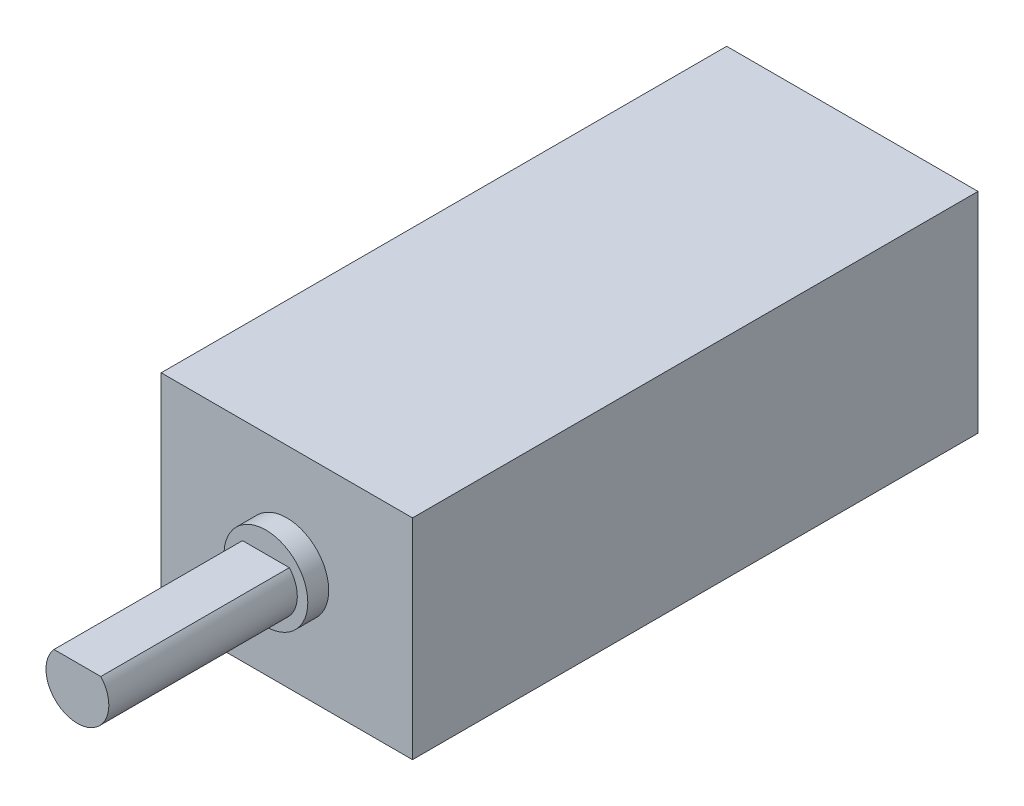
ISO-10303-21;
HEADER;
FILE_DESCRIPTION(('STEP AP214'),'2;1');
FILE_NAME('part.step','',(''),(''),'','','');
FILE_SCHEMA(('AUTOMOTIVE_DESIGN { 1 0 10303 214 1 1 1 1 }'));
ENDSEC;
DATA;
#1=APPLICATION_CONTEXT('core data for automotive mechanical design processes');
#2=APPLICATION_PROTOCOL_DEFINITION('international standard','automotive_design',2000,#1);
#3=PRODUCT_CONTEXT('',#1,'mechanical');
#4=PRODUCT('Part','Part','',(#3));
#5=PRODUCT_RELATED_PRODUCT_CATEGORY('part','',(#4));
#6=PRODUCT_DEFINITION_FORMATION('','',#4);
#7=PRODUCT_DEFINITION_CONTEXT('part definition',#1,'design');
#8=PRODUCT_DEFINITION('design','',#6,#7);
#9=PRODUCT_DEFINITION_SHAPE('','',#8);
#10=(LENGTH_UNIT() NAMED_UNIT(*) SI_UNIT(.MILLI.,.METRE.));
#11=(NAMED_UNIT(*) PLANE_ANGLE_UNIT() SI_UNIT($,.RADIAN.));
#12=(NAMED_UNIT(*) SI_UNIT($,.STERADIAN.) SOLID_ANGLE_UNIT());
#13=UNCERTAINTY_MEASURE_WITH_UNIT(LENGTH_MEASURE(1.E-05),#10,'distance_accuracy_value','');
#14=(GEOMETRIC_REPRESENTATION_CONTEXT(3) GLOBAL_UNCERTAINTY_ASSIGNED_CONTEXT((#13)) GLOBAL_UNIT_ASSIGNED_CONTEXT((#10,
#11,#12)) REPRESENTATION_CONTEXT('',''));
#15=CARTESIAN_POINT('',(0.,0.,0.));
#16=DIRECTION('',(0.,0.,1.));
#17=DIRECTION('',(1.,0.,0.));
#18=AXIS2_PLACEMENT_3D('',#15,#16,#17);
#19=CARTESIAN_POINT('',(6.,10.,-13.5));
#20=DIRECTION('',(-1.,0.,0.));
#21=DIRECTION('',(0.,0.,1.));
#22=AXIS2_PLACEMENT_3D('',#19,#20,#21);
#23=PLANE('',#22);
#24=DIRECTION('',(0.,0.,-1.));
#25=VECTOR('',#24,1.);
#26=CARTESIAN_POINT('',(6.,0.,-13.5));
#27=LINE('',#26,#25);
#28=CARTESIAN_POINT('',(6.,0.,13.5));
#29=VERTEX_POINT('',#28);
#30=CARTESIAN_POINT('',(6.,0.,-13.5));
#31=VERTEX_POINT('',#30);
#32=EDGE_CURVE('E133',#29,#31,#27,.T.);
#33=ORIENTED_EDGE('',*,*,#32,.T.);
#34=DIRECTION('',(0.,-1.,0.));
#35=VECTOR('',#34,1.);
#36=CARTESIAN_POINT('',(6.,10.,-13.5));
#37=LINE('',#36,#35);
#38=CARTESIAN_POINT('',(6.,10.,-13.5));
#39=VERTEX_POINT('',#38);
#40=EDGE_CURVE('E48',#39,#31,#37,.T.);
#41=ORIENTED_EDGE('',*,*,#40,.F.);
#42=DIRECTION('',(0.,0.,-1.));
#43=VECTOR('',#42,1.);
#44=CARTESIAN_POINT('',(6.,10.,-13.5));
#45=LINE('',#44,#43);
#46=CARTESIAN_POINT('',(6.,10.,13.5));
#47=VERTEX_POINT('',#46);
#48=EDGE_CURVE('E138',#47,#39,#45,.T.);
#49=ORIENTED_EDGE('',*,*,#48,.F.);
#50=DIRECTION('',(0.,-1.,0.));
#51=VECTOR('',#50,1.);
#52=CARTESIAN_POINT('',(6.,10.,13.5));
#53=LINE('',#52,#51);
#54=EDGE_CURVE('E148',#47,#29,#53,.T.);
#55=ORIENTED_EDGE('',*,*,#54,.T.);
#56=EDGE_LOOP('',(#33,#41,#49,#55));
#57=FACE_BOUND('',#56,.T.);
#58=ADVANCED_FACE('F45',(#57),#23,.F.);
#59=CARTESIAN_POINT('',(-6.,10.,-13.5));
#60=DIRECTION('',(0.,0.,1.));
#61=DIRECTION('',(1.,0.,0.));
#62=AXIS2_PLACEMENT_3D('',#59,#60,#61);
#63=PLANE('',#62);
#64=DIRECTION('',(-1.,0.,0.));
#65=VECTOR('',#64,1.);
#66=CARTESIAN_POINT('',(-6.,0.,-13.5));
#67=LINE('',#66,#65);
#68=CARTESIAN_POINT('',(-6.,0.,-13.5));
#69=VERTEX_POINT('',#68);
#70=EDGE_CURVE('E152',#31,#69,#67,.T.);
#71=ORIENTED_EDGE('',*,*,#70,.T.);
#72=DIRECTION('',(0.,-1.,0.));
#73=VECTOR('',#72,1.);
#74=CARTESIAN_POINT('',(-6.,10.,-13.5));
#75=LINE('',#74,#73);
#76=CARTESIAN_POINT('',(-6.,10.,-13.5));
#77=VERTEX_POINT('',#76);
#78=EDGE_CURVE('E164',#77,#69,#75,.T.);
#79=ORIENTED_EDGE('',*,*,#78,.F.);
#80=DIRECTION('',(-1.,0.,0.));
#81=VECTOR('',#80,1.);
#82=CARTESIAN_POINT('',(-6.,10.,-13.5));
#83=LINE('',#82,#81);
#84=EDGE_CURVE('E98',#39,#77,#83,.T.);
#85=ORIENTED_EDGE('',*,*,#84,.F.);
#86=ORIENTED_EDGE('',*,*,#40,.T.);
#87=EDGE_LOOP('',(#71,#79,#85,#86));
#88=FACE_BOUND('',#87,.T.);
#89=ADVANCED_FACE('F172',(#88),#63,.F.);
#90=CARTESIAN_POINT('',(-6.,10.,-13.5));
#91=DIRECTION('',(1.,0.,0.));
#92=DIRECTION('',(0.,0.,-1.));
#93=AXIS2_PLACEMENT_3D('',#90,#91,#92);
#94=PLANE('',#93);
#95=DIRECTION('',(0.,0.,1.));
#96=VECTOR('',#95,1.);
#97=CARTESIAN_POINT('',(-6.,0.,-13.5));
#98=LINE('',#97,#96);
#99=CARTESIAN_POINT('',(-6.,0.,13.5));
#100=VERTEX_POINT('',#99);
#101=EDGE_CURVE('E155',#69,#100,#98,.T.);
#102=ORIENTED_EDGE('',*,*,#101,.T.);
#103=DIRECTION('',(0.,-1.,0.));
#104=VECTOR('',#103,1.);
#105=CARTESIAN_POINT('',(-6.,10.,13.5));
#106=LINE('',#105,#104);
#107=CARTESIAN_POINT('',(-6.,10.,13.5));
#108=VERTEX_POINT('',#107);
#109=EDGE_CURVE('E162',#108,#100,#106,.T.);
#110=ORIENTED_EDGE('',*,*,#109,.F.);
#111=DIRECTION('',(0.,0.,1.));
#112=VECTOR('',#111,1.);
#113=CARTESIAN_POINT('',(-6.,10.,-13.5));
#114=LINE('',#113,#112);
#115=EDGE_CURVE('E143',#77,#108,#114,.T.);
#116=ORIENTED_EDGE('',*,*,#115,.F.);
#117=ORIENTED_EDGE('',*,*,#78,.T.);
#118=EDGE_LOOP('',(#102,#110,#116,#117));
#119=FACE_BOUND('',#118,.T.);
#120=ADVANCED_FACE('F179',(#119),#94,.F.);
#121=CARTESIAN_POINT('',(-6.,10.,13.5));
#122=DIRECTION('',(0.,0.,-1.));
#123=DIRECTION('',(-1.,0.,0.));
#124=AXIS2_PLACEMENT_3D('',#121,#122,#123);
#125=PLANE('',#124);
#126=CARTESIAN_POINT('',(0.,5.,13.5));
#127=DIRECTION('',(0.,0.,1.));
#128=DIRECTION('',(1.,0.,0.));
#129=AXIS2_PLACEMENT_3D('',#126,#127,#128);
#130=CIRCLE('',#129,2.);
#131=CARTESIAN_POINT('',(2.,5.,13.5));
#132=VERTEX_POINT('',#131);
#133=EDGE_CURVE('E11',#132,#132,#130,.T.);
#134=ORIENTED_EDGE('',*,*,#133,.F.);
#135=EDGE_LOOP('',(#134));
#136=FACE_BOUND('',#135,.T.);
#137=DIRECTION('',(1.,0.,0.));
#138=VECTOR('',#137,1.);
#139=CARTESIAN_POINT('',(-6.,0.,13.5));
#140=LINE('',#139,#138);
#141=EDGE_CURVE('E90',#100,#29,#140,.T.);
#142=ORIENTED_EDGE('',*,*,#141,.T.);
#143=ORIENTED_EDGE('',*,*,#54,.F.);
#144=DIRECTION('',(1.,0.,0.));
#145=VECTOR('',#144,1.);
#146=CARTESIAN_POINT('',(-6.,10.,13.5));
#147=LINE('',#146,#145);
#148=EDGE_CURVE('E69',#108,#47,#147,.T.);
#149=ORIENTED_EDGE('',*,*,#148,.F.);
#150=ORIENTED_EDGE('',*,*,#109,.T.);
#151=EDGE_LOOP('',(#142,#143,#149,#150));
#152=FACE_BOUND('',#151,.T.);
#153=ADVANCED_FACE('F180',(#136,#152),#125,.F.);
#154=CARTESIAN_POINT('',(0.,10.,0.));
#155=DIRECTION('',(0.,1.,0.));
#156=DIRECTION('',(0.,0.,1.));
#157=AXIS2_PLACEMENT_3D('',#154,#155,#156);
#158=PLANE('',#157);
#159=ORIENTED_EDGE('',*,*,#48,.T.);
#160=ORIENTED_EDGE('',*,*,#84,.T.);
#161=ORIENTED_EDGE('',*,*,#115,.T.);
#162=ORIENTED_EDGE('',*,*,#148,.T.);
#163=EDGE_LOOP('',(#159,#160,#161,#162));
#164=FACE_BOUND('',#163,.T.);
#165=ADVANCED_FACE('F181',(#164),#158,.T.);
#166=CARTESIAN_POINT('',(0.,0.,0.));
#167=DIRECTION('',(0.,1.,0.));
#168=DIRECTION('',(0.,0.,1.));
#169=AXIS2_PLACEMENT_3D('',#166,#167,#168);
#170=PLANE('',#169);
#171=ORIENTED_EDGE('',*,*,#32,.F.);
#172=ORIENTED_EDGE('',*,*,#141,.F.);
#173=ORIENTED_EDGE('',*,*,#101,.F.);
#174=ORIENTED_EDGE('',*,*,#70,.F.);
#175=EDGE_LOOP('',(#171,#172,#173,#174));
#176=FACE_BOUND('',#175,.T.);
#177=ADVANCED_FACE('F177',(#176),#170,.F.);
#178=CARTESIAN_POINT('',(0.,5.,14.5));
#179=DIRECTION('',(0.,0.,-1.));
#180=DIRECTION('',(-1.,0.,0.));
#181=AXIS2_PLACEMENT_3D('',#178,#179,#180);
#182=CYLINDRICAL_SURFACE('',#181,2.);
#183=CARTESIAN_POINT('',(0.,5.,14.5));
#184=DIRECTION('',(0.,0.,1.));
#185=DIRECTION('',(1.,0.,0.));
#186=AXIS2_PLACEMENT_3D('',#183,#184,#185);
#187=CIRCLE('',#186,2.);
#188=CARTESIAN_POINT('',(2.,5.,14.5));
#189=VERTEX_POINT('',#188);
#190=EDGE_CURVE('E128',#189,#189,#187,.T.);
#191=ORIENTED_EDGE('',*,*,#190,.F.);
#192=EDGE_LOOP('',(#191));
#193=FACE_BOUND('',#192,.T.);
#194=ORIENTED_EDGE('',*,*,#133,.T.);
#195=EDGE_LOOP('',(#194));
#196=FACE_BOUND('',#195,.T.);
#197=ADVANCED_FACE('F188',(#193,#196),#182,.T.);
#198=CARTESIAN_POINT('',(0.,5.,14.5));
#199=DIRECTION('',(0.,0.,1.));
#200=DIRECTION('',(1.,0.,0.));
#201=AXIS2_PLACEMENT_3D('',#198,#199,#200);
#202=PLANE('',#201);
#203=CARTESIAN_POINT('',(0.,5.,14.5));
#204=DIRECTION('',(0.,0.,1.));
#205=DIRECTION('',(1.,0.,0.));
#206=AXIS2_PLACEMENT_3D('',#203,#204,#205);
#207=CIRCLE('',#206,1.5);
#208=CARTESIAN_POINT('',(-1.11803398874989,6.,14.5));
#209=VERTEX_POINT('',#208);
#210=CARTESIAN_POINT('',(1.11803398874989,6.,14.5));
#211=VERTEX_POINT('',#210);
#212=EDGE_CURVE('E126',#209,#211,#207,.T.);
#213=ORIENTED_EDGE('',*,*,#212,.F.);
#214=DIRECTION('',(-1.,0.,0.));
#215=VECTOR('',#214,1.);
#216=CARTESIAN_POINT('',(-1.11803398874989,6.,14.5));
#217=LINE('',#216,#215);
#218=EDGE_CURVE('E60',#211,#209,#217,.T.);
#219=ORIENTED_EDGE('',*,*,#218,.F.);
#220=EDGE_LOOP('',(#213,#219));
#221=FACE_BOUND('',#220,.T.);
#222=ORIENTED_EDGE('',*,*,#190,.T.);
#223=EDGE_LOOP('',(#222));
#224=FACE_BOUND('',#223,.T.);
#225=ADVANCED_FACE('F232',(#221,#224),#202,.T.);
#226=CARTESIAN_POINT('',(0.,5.,23.5));
#227=DIRECTION('',(0.,0.,-1.));
#228=DIRECTION('',(-1.,0.,0.));
#229=AXIS2_PLACEMENT_3D('',#226,#227,#228);
#230=CYLINDRICAL_SURFACE('',#229,1.5);
#231=ORIENTED_EDGE('',*,*,#212,.T.);
#232=DIRECTION('',(0.,0.,-1.));
#233=VECTOR('',#232,1.);
#234=CARTESIAN_POINT('',(1.11803398874989,6.,23.5));
#235=LINE('',#234,#233);
#236=CARTESIAN_POINT('',(1.11803398874989,6.,23.5));
#237=VERTEX_POINT('',#236);
#238=EDGE_CURVE('E112',#237,#211,#235,.T.);
#239=ORIENTED_EDGE('',*,*,#238,.F.);
#240=CARTESIAN_POINT('',(0.,5.,23.5));
#241=DIRECTION('',(0.,0.,1.));
#242=DIRECTION('',(1.,0.,0.));
#243=AXIS2_PLACEMENT_3D('',#240,#241,#242);
#244=CIRCLE('',#243,1.5);
#245=CARTESIAN_POINT('',(-1.11803398874989,6.,23.5));
#246=VERTEX_POINT('',#245);
#247=EDGE_CURVE('E119',#246,#237,#244,.T.);
#248=ORIENTED_EDGE('',*,*,#247,.F.);
#249=DIRECTION('',(0.,0.,-1.));
#250=VECTOR('',#249,1.);
#251=CARTESIAN_POINT('',(-1.11803398874989,6.,23.5));
#252=LINE('',#251,#250);
#253=EDGE_CURVE('E115',#246,#209,#252,.T.);
#254=ORIENTED_EDGE('',*,*,#253,.T.);
#255=EDGE_LOOP('',(#231,#239,#248,#254));
#256=FACE_BOUND('',#255,.T.);
#257=ADVANCED_FACE('F125',(#256),#230,.T.);
#258=CARTESIAN_POINT('',(-1.11803398874989,6.,23.5));
#259=DIRECTION('',(0.,-1.,0.));
#260=DIRECTION('',(0.,0.,-1.));
#261=AXIS2_PLACEMENT_3D('',#258,#259,#260);
#262=PLANE('',#261);
#263=ORIENTED_EDGE('',*,*,#218,.T.);
#264=ORIENTED_EDGE('',*,*,#253,.F.);
#265=DIRECTION('',(-1.,0.,0.));
#266=VECTOR('',#265,1.);
#267=CARTESIAN_POINT('',(-1.11803398874989,6.,23.5));
#268=LINE('',#267,#266);
#269=EDGE_CURVE('E108',#237,#246,#268,.T.);
#270=ORIENTED_EDGE('',*,*,#269,.F.);
#271=ORIENTED_EDGE('',*,*,#238,.T.);
#272=EDGE_LOOP('',(#263,#264,#270,#271));
#273=FACE_BOUND('',#272,.T.);
#274=ADVANCED_FACE('F110',(#273),#262,.F.);
#275=CARTESIAN_POINT('',(0.,5.,23.5));
#276=DIRECTION('',(0.,0.,1.));
#277=DIRECTION('',(1.,0.,0.));
#278=AXIS2_PLACEMENT_3D('',#275,#276,#277);
#279=PLANE('',#278);
#280=ORIENTED_EDGE('',*,*,#247,.T.);
#281=ORIENTED_EDGE('',*,*,#269,.T.);
#282=EDGE_LOOP('',(#280,#281));
#283=FACE_BOUND('',#282,.T.);
#284=ADVANCED_FACE('F121',(#283),#279,.T.);
#285=CLOSED_SHELL('',(#58,#89,#120,#153,#165,#177,#197,#225,#257,#274,#284));
#286=MANIFOLD_SOLID_BREP('B2',#285);
#287=ADVANCED_BREP_SHAPE_REPRESENTATION('',(#18,#286),#14);
#288=SHAPE_DEFINITION_REPRESENTATION(#9,#287);
ENDSEC;
END-ISO-10303-21;
